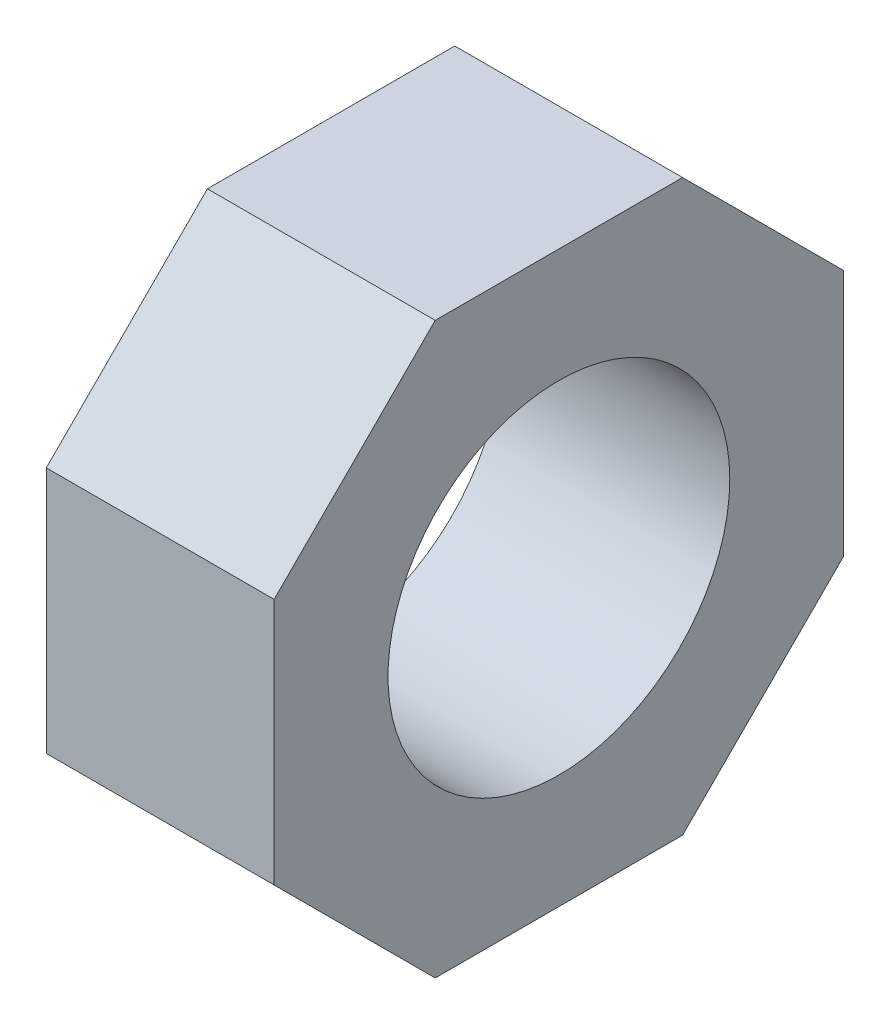
ISO-10303-21;
HEADER;
FILE_DESCRIPTION(('STEP AP214'),'2;1');
FILE_NAME('part.step','',(''),(''),'','','');
FILE_SCHEMA(('AUTOMOTIVE_DESIGN { 1 0 10303 214 1 1 1 1 }'));
ENDSEC;
DATA;
#1=APPLICATION_CONTEXT('core data for automotive mechanical design processes');
#2=APPLICATION_PROTOCOL_DEFINITION('international standard','automotive_design',2000,#1);
#3=PRODUCT_CONTEXT('',#1,'mechanical');
#4=PRODUCT('Part','Part','',(#3));
#5=PRODUCT_RELATED_PRODUCT_CATEGORY('part','',(#4));
#6=PRODUCT_DEFINITION_FORMATION('','',#4);
#7=PRODUCT_DEFINITION_CONTEXT('part definition',#1,'design');
#8=PRODUCT_DEFINITION('design','',#6,#7);
#9=PRODUCT_DEFINITION_SHAPE('','',#8);
#10=(LENGTH_UNIT() NAMED_UNIT(*) SI_UNIT(.MILLI.,.METRE.));
#11=(NAMED_UNIT(*) PLANE_ANGLE_UNIT() SI_UNIT($,.RADIAN.));
#12=(NAMED_UNIT(*) SI_UNIT($,.STERADIAN.) SOLID_ANGLE_UNIT());
#13=UNCERTAINTY_MEASURE_WITH_UNIT(LENGTH_MEASURE(1.E-05),#10,'distance_accuracy_value','');
#14=(GEOMETRIC_REPRESENTATION_CONTEXT(3) GLOBAL_UNCERTAINTY_ASSIGNED_CONTEXT((#13)) GLOBAL_UNIT_ASSIGNED_CONTEXT((#10,
#11,#12)) REPRESENTATION_CONTEXT('',''));
#15=CARTESIAN_POINT('',(0.,0.,0.));
#16=DIRECTION('',(0.,0.,1.));
#17=DIRECTION('',(1.,0.,0.));
#18=AXIS2_PLACEMENT_3D('',#15,#16,#17);
#19=CARTESIAN_POINT('',(2.,0.,0.));
#20=DIRECTION('',(1.,0.,0.));
#21=DIRECTION('',(0.,0.,-1.));
#22=AXIS2_PLACEMENT_3D('',#19,#20,#21);
#23=PLANE('',#22);
#24=DIRECTION('',(0.,0.707106781186549,0.707106781186546));
#25=VECTOR('',#24,1.);
#26=CARTESIAN_POINT('',(2.,2.5,-1.08578643762691));
#27=LINE('',#26,#25);
#28=CARTESIAN_POINT('',(2.,1.0857864376269,-2.5));
#29=VERTEX_POINT('',#28);
#30=CARTESIAN_POINT('',(2.,2.5,-1.08578643762691));
#31=VERTEX_POINT('',#30);
#32=EDGE_CURVE('E164',#29,#31,#27,.T.);
#33=ORIENTED_EDGE('',*,*,#32,.T.);
#34=DIRECTION('',(0.,0.,1.));
#35=VECTOR('',#34,1.);
#36=CARTESIAN_POINT('',(2.,2.5,1.08578643762691));
#37=LINE('',#36,#35);
#38=CARTESIAN_POINT('',(2.,2.5,1.08578643762691));
#39=VERTEX_POINT('',#38);
#40=EDGE_CURVE('E100',#31,#39,#37,.T.);
#41=ORIENTED_EDGE('',*,*,#40,.T.);
#42=DIRECTION('',(0.,-0.707106781186549,0.707106781186546));
#43=VECTOR('',#42,1.);
#44=CARTESIAN_POINT('',(2.,2.5,1.08578643762691));
#45=LINE('',#44,#43);
#46=CARTESIAN_POINT('',(2.,1.0857864376269,2.5));
#47=VERTEX_POINT('',#46);
#48=EDGE_CURVE('E185',#39,#47,#45,.T.);
#49=ORIENTED_EDGE('',*,*,#48,.T.);
#50=DIRECTION('',(0.,-1.,0.));
#51=VECTOR('',#50,1.);
#52=CARTESIAN_POINT('',(2.,1.0857864376269,2.5));
#53=LINE('',#52,#51);
#54=CARTESIAN_POINT('',(2.,-1.0857864376269,2.5));
#55=VERTEX_POINT('',#54);
#56=EDGE_CURVE('E199',#47,#55,#53,.T.);
#57=ORIENTED_EDGE('',*,*,#56,.T.);
#58=DIRECTION('',(0.,-0.707106781186549,-0.707106781186546));
#59=VECTOR('',#58,1.);
#60=CARTESIAN_POINT('',(2.,-2.5,1.08578643762691));
#61=LINE('',#60,#59);
#62=CARTESIAN_POINT('',(2.,-2.5,1.08578643762691));
#63=VERTEX_POINT('',#62);
#64=EDGE_CURVE('E119',#55,#63,#61,.T.);
#65=ORIENTED_EDGE('',*,*,#64,.T.);
#66=DIRECTION('',(0.,0.,-1.));
#67=VECTOR('',#66,1.);
#68=CARTESIAN_POINT('',(2.,-2.5,1.08578643762691));
#69=LINE('',#68,#67);
#70=CARTESIAN_POINT('',(2.,-2.5,-1.08578643762691));
#71=VERTEX_POINT('',#70);
#72=EDGE_CURVE('E113',#63,#71,#69,.T.);
#73=ORIENTED_EDGE('',*,*,#72,.T.);
#74=DIRECTION('',(0.,0.707106781186549,-0.707106781186546));
#75=VECTOR('',#74,1.);
#76=CARTESIAN_POINT('',(2.,-2.5,-1.08578643762691));
#77=LINE('',#76,#75);
#78=CARTESIAN_POINT('',(2.,-1.0857864376269,-2.5));
#79=VERTEX_POINT('',#78);
#80=EDGE_CURVE('E117',#71,#79,#77,.T.);
#81=ORIENTED_EDGE('',*,*,#80,.T.);
#82=DIRECTION('',(0.,1.,0.));
#83=VECTOR('',#82,1.);
#84=CARTESIAN_POINT('',(2.,1.0857864376269,-2.5));
#85=LINE('',#84,#83);
#86=EDGE_CURVE('E57',#79,#29,#85,.T.);
#87=ORIENTED_EDGE('',*,*,#86,.T.);
#88=EDGE_LOOP('',(#33,#41,#49,#57,#65,#73,#81,#87));
#89=FACE_BOUND('',#88,.T.);
#90=CARTESIAN_POINT('',(2.,0.,0.));
#91=DIRECTION('',(1.,0.,0.));
#92=DIRECTION('',(0.,0.,-1.));
#93=AXIS2_PLACEMENT_3D('',#90,#91,#92);
#94=CIRCLE('',#93,1.5);
#95=CARTESIAN_POINT('',(2.,0.,-1.5));
#96=VERTEX_POINT('',#95);
#97=EDGE_CURVE('E146',#96,#96,#94,.T.);
#98=ORIENTED_EDGE('',*,*,#97,.F.);
#99=EDGE_LOOP('',(#98));
#100=FACE_BOUND('',#99,.T.);
#101=ADVANCED_FACE('F39',(#89,#100),#23,.T.);
#102=CARTESIAN_POINT('',(0.,0.,0.));
#103=DIRECTION('',(1.,0.,0.));
#104=DIRECTION('',(0.,0.,-1.));
#105=AXIS2_PLACEMENT_3D('',#102,#103,#104);
#106=PLANE('',#105);
#107=DIRECTION('',(0.,0.707106781186549,0.707106781186546));
#108=VECTOR('',#107,1.);
#109=CARTESIAN_POINT('',(0.,2.5,-1.08578643762691));
#110=LINE('',#109,#108);
#111=CARTESIAN_POINT('',(0.,1.0857864376269,-2.5));
#112=VERTEX_POINT('',#111);
#113=CARTESIAN_POINT('',(0.,2.5,-1.08578643762691));
#114=VERTEX_POINT('',#113);
#115=EDGE_CURVE('E141',#112,#114,#110,.T.);
#116=ORIENTED_EDGE('',*,*,#115,.F.);
#117=DIRECTION('',(0.,1.,0.));
#118=VECTOR('',#117,1.);
#119=CARTESIAN_POINT('',(0.,1.0857864376269,-2.5));
#120=LINE('',#119,#118);
#121=CARTESIAN_POINT('',(0.,-1.0857864376269,-2.5));
#122=VERTEX_POINT('',#121);
#123=EDGE_CURVE('E92',#122,#112,#120,.T.);
#124=ORIENTED_EDGE('',*,*,#123,.F.);
#125=DIRECTION('',(0.,0.707106781186549,-0.707106781186546));
#126=VECTOR('',#125,1.);
#127=CARTESIAN_POINT('',(0.,-2.5,-1.08578643762691));
#128=LINE('',#127,#126);
#129=CARTESIAN_POINT('',(0.,-2.5,-1.08578643762691));
#130=VERTEX_POINT('',#129);
#131=EDGE_CURVE('E86',#130,#122,#128,.T.);
#132=ORIENTED_EDGE('',*,*,#131,.F.);
#133=DIRECTION('',(0.,0.,-1.));
#134=VECTOR('',#133,1.);
#135=CARTESIAN_POINT('',(0.,-2.5,1.08578643762691));
#136=LINE('',#135,#134);
#137=CARTESIAN_POINT('',(0.,-2.5,1.08578643762691));
#138=VERTEX_POINT('',#137);
#139=EDGE_CURVE('E128',#138,#130,#136,.T.);
#140=ORIENTED_EDGE('',*,*,#139,.F.);
#141=DIRECTION('',(0.,-0.707106781186549,-0.707106781186546));
#142=VECTOR('',#141,1.);
#143=CARTESIAN_POINT('',(0.,-2.5,1.08578643762691));
#144=LINE('',#143,#142);
#145=CARTESIAN_POINT('',(0.,-1.0857864376269,2.5));
#146=VERTEX_POINT('',#145);
#147=EDGE_CURVE('E155',#146,#138,#144,.T.);
#148=ORIENTED_EDGE('',*,*,#147,.F.);
#149=DIRECTION('',(0.,-1.,0.));
#150=VECTOR('',#149,1.);
#151=CARTESIAN_POINT('',(0.,1.0857864376269,2.5));
#152=LINE('',#151,#150);
#153=CARTESIAN_POINT('',(0.,1.0857864376269,2.5));
#154=VERTEX_POINT('',#153);
#155=EDGE_CURVE('E152',#154,#146,#152,.T.);
#156=ORIENTED_EDGE('',*,*,#155,.F.);
#157=DIRECTION('',(0.,-0.707106781186549,0.707106781186546));
#158=VECTOR('',#157,1.);
#159=CARTESIAN_POINT('',(0.,2.5,1.08578643762691));
#160=LINE('',#159,#158);
#161=CARTESIAN_POINT('',(0.,2.5,1.08578643762691));
#162=VERTEX_POINT('',#161);
#163=EDGE_CURVE('E149',#162,#154,#160,.T.);
#164=ORIENTED_EDGE('',*,*,#163,.F.);
#165=DIRECTION('',(0.,0.,1.));
#166=VECTOR('',#165,1.);
#167=CARTESIAN_POINT('',(0.,2.5,1.08578643762691));
#168=LINE('',#167,#166);
#169=EDGE_CURVE('E145',#114,#162,#168,.T.);
#170=ORIENTED_EDGE('',*,*,#169,.F.);
#171=EDGE_LOOP('',(#116,#124,#132,#140,#148,#156,#164,#170));
#172=FACE_BOUND('',#171,.T.);
#173=CARTESIAN_POINT('',(0.,0.,0.));
#174=DIRECTION('',(1.,0.,0.));
#175=DIRECTION('',(0.,0.,-1.));
#176=AXIS2_PLACEMENT_3D('',#173,#174,#175);
#177=CIRCLE('',#176,1.5);
#178=CARTESIAN_POINT('',(0.,0.,-1.5));
#179=VERTEX_POINT('',#178);
#180=EDGE_CURVE('E209',#179,#179,#177,.T.);
#181=ORIENTED_EDGE('',*,*,#180,.T.);
#182=EDGE_LOOP('',(#181));
#183=FACE_BOUND('',#182,.T.);
#184=ADVANCED_FACE('F189',(#172,#183),#106,.F.);
#185=CARTESIAN_POINT('',(2.,2.5,-1.08578643762691));
#186=DIRECTION('',(0.,-0.707106781186546,0.707106781186549));
#187=DIRECTION('',(0.,-0.707106781186549,-0.707106781186546));
#188=AXIS2_PLACEMENT_3D('',#185,#186,#187);
#189=PLANE('',#188);
#190=ORIENTED_EDGE('',*,*,#115,.T.);
#191=DIRECTION('',(-1.,0.,0.));
#192=VECTOR('',#191,1.);
#193=CARTESIAN_POINT('',(2.,2.5,-1.08578643762691));
#194=LINE('',#193,#192);
#195=EDGE_CURVE('E11',#31,#114,#194,.T.);
#196=ORIENTED_EDGE('',*,*,#195,.F.);
#197=ORIENTED_EDGE('',*,*,#32,.F.);
#198=DIRECTION('',(-1.,0.,0.));
#199=VECTOR('',#198,1.);
#200=CARTESIAN_POINT('',(2.,1.0857864376269,-2.5));
#201=LINE('',#200,#199);
#202=EDGE_CURVE('E137',#29,#112,#201,.T.);
#203=ORIENTED_EDGE('',*,*,#202,.T.);
#204=EDGE_LOOP('',(#190,#196,#197,#203));
#205=FACE_BOUND('',#204,.T.);
#206=ADVANCED_FACE('F41',(#205),#189,.F.);
#207=CARTESIAN_POINT('',(2.,2.5,1.08578643762691));
#208=DIRECTION('',(0.,-1.,0.));
#209=DIRECTION('',(0.,0.,-1.));
#210=AXIS2_PLACEMENT_3D('',#207,#208,#209);
#211=PLANE('',#210);
#212=ORIENTED_EDGE('',*,*,#169,.T.);
#213=DIRECTION('',(-1.,0.,0.));
#214=VECTOR('',#213,1.);
#215=CARTESIAN_POINT('',(2.,2.5,1.08578643762691));
#216=LINE('',#215,#214);
#217=EDGE_CURVE('E49',#39,#162,#216,.T.);
#218=ORIENTED_EDGE('',*,*,#217,.F.);
#219=ORIENTED_EDGE('',*,*,#40,.F.);
#220=ORIENTED_EDGE('',*,*,#195,.T.);
#221=EDGE_LOOP('',(#212,#218,#219,#220));
#222=FACE_BOUND('',#221,.T.);
#223=ADVANCED_FACE('F239',(#222),#211,.F.);
#224=CARTESIAN_POINT('',(2.,2.5,1.08578643762691));
#225=DIRECTION('',(0.,-0.707106781186546,-0.707106781186549));
#226=DIRECTION('',(0.,0.707106781186549,-0.707106781186546));
#227=AXIS2_PLACEMENT_3D('',#224,#225,#226);
#228=PLANE('',#227);
#229=ORIENTED_EDGE('',*,*,#163,.T.);
#230=DIRECTION('',(-1.,0.,0.));
#231=VECTOR('',#230,1.);
#232=CARTESIAN_POINT('',(2.,1.0857864376269,2.5));
#233=LINE('',#232,#231);
#234=EDGE_CURVE('E175',#47,#154,#233,.T.);
#235=ORIENTED_EDGE('',*,*,#234,.F.);
#236=ORIENTED_EDGE('',*,*,#48,.F.);
#237=ORIENTED_EDGE('',*,*,#217,.T.);
#238=EDGE_LOOP('',(#229,#235,#236,#237));
#239=FACE_BOUND('',#238,.T.);
#240=ADVANCED_FACE('F183',(#239),#228,.F.);
#241=CARTESIAN_POINT('',(2.,1.0857864376269,2.5));
#242=DIRECTION('',(0.,0.,-1.));
#243=DIRECTION('',(-1.,0.,0.));
#244=AXIS2_PLACEMENT_3D('',#241,#242,#243);
#245=PLANE('',#244);
#246=ORIENTED_EDGE('',*,*,#155,.T.);
#247=DIRECTION('',(-1.,0.,0.));
#248=VECTOR('',#247,1.);
#249=CARTESIAN_POINT('',(2.,-1.0857864376269,2.5));
#250=LINE('',#249,#248);
#251=EDGE_CURVE('E171',#55,#146,#250,.T.);
#252=ORIENTED_EDGE('',*,*,#251,.F.);
#253=ORIENTED_EDGE('',*,*,#56,.F.);
#254=ORIENTED_EDGE('',*,*,#234,.T.);
#255=EDGE_LOOP('',(#246,#252,#253,#254));
#256=FACE_BOUND('',#255,.T.);
#257=ADVANCED_FACE('F194',(#256),#245,.F.);
#258=CARTESIAN_POINT('',(2.,-2.5,1.08578643762691));
#259=DIRECTION('',(0.,0.707106781186546,-0.707106781186549));
#260=DIRECTION('',(0.,0.707106781186549,0.707106781186546));
#261=AXIS2_PLACEMENT_3D('',#258,#259,#260);
#262=PLANE('',#261);
#263=ORIENTED_EDGE('',*,*,#147,.T.);
#264=DIRECTION('',(-1.,0.,0.));
#265=VECTOR('',#264,1.);
#266=CARTESIAN_POINT('',(2.,-2.5,1.08578643762691));
#267=LINE('',#266,#265);
#268=EDGE_CURVE('E130',#63,#138,#267,.T.);
#269=ORIENTED_EDGE('',*,*,#268,.F.);
#270=ORIENTED_EDGE('',*,*,#64,.F.);
#271=ORIENTED_EDGE('',*,*,#251,.T.);
#272=EDGE_LOOP('',(#263,#269,#270,#271));
#273=FACE_BOUND('',#272,.T.);
#274=ADVANCED_FACE('F197',(#273),#262,.F.);
#275=CARTESIAN_POINT('',(2.,-2.5,1.08578643762691));
#276=DIRECTION('',(0.,1.,0.));
#277=DIRECTION('',(0.,0.,1.));
#278=AXIS2_PLACEMENT_3D('',#275,#276,#277);
#279=PLANE('',#278);
#280=ORIENTED_EDGE('',*,*,#139,.T.);
#281=DIRECTION('',(-1.,0.,0.));
#282=VECTOR('',#281,1.);
#283=CARTESIAN_POINT('',(2.,-2.5,-1.08578643762691));
#284=LINE('',#283,#282);
#285=EDGE_CURVE('E125',#71,#130,#284,.T.);
#286=ORIENTED_EDGE('',*,*,#285,.F.);
#287=ORIENTED_EDGE('',*,*,#72,.F.);
#288=ORIENTED_EDGE('',*,*,#268,.T.);
#289=EDGE_LOOP('',(#280,#286,#287,#288));
#290=FACE_BOUND('',#289,.T.);
#291=ADVANCED_FACE('F126',(#290),#279,.F.);
#292=CARTESIAN_POINT('',(2.,-2.5,-1.08578643762691));
#293=DIRECTION('',(0.,0.707106781186546,0.707106781186549));
#294=DIRECTION('',(0.,-0.707106781186549,0.707106781186546));
#295=AXIS2_PLACEMENT_3D('',#292,#293,#294);
#296=PLANE('',#295);
#297=ORIENTED_EDGE('',*,*,#131,.T.);
#298=DIRECTION('',(-1.,0.,0.));
#299=VECTOR('',#298,1.);
#300=CARTESIAN_POINT('',(2.,-1.0857864376269,-2.5));
#301=LINE('',#300,#299);
#302=EDGE_CURVE('E131',#79,#122,#301,.T.);
#303=ORIENTED_EDGE('',*,*,#302,.F.);
#304=ORIENTED_EDGE('',*,*,#80,.F.);
#305=ORIENTED_EDGE('',*,*,#285,.T.);
#306=EDGE_LOOP('',(#297,#303,#304,#305));
#307=FACE_BOUND('',#306,.T.);
#308=ADVANCED_FACE('F133',(#307),#296,.F.);
#309=CARTESIAN_POINT('',(2.,1.0857864376269,-2.5));
#310=DIRECTION('',(0.,0.,1.));
#311=DIRECTION('',(1.,0.,0.));
#312=AXIS2_PLACEMENT_3D('',#309,#310,#311);
#313=PLANE('',#312);
#314=ORIENTED_EDGE('',*,*,#123,.T.);
#315=ORIENTED_EDGE('',*,*,#202,.F.);
#316=ORIENTED_EDGE('',*,*,#86,.F.);
#317=ORIENTED_EDGE('',*,*,#302,.T.);
#318=EDGE_LOOP('',(#314,#315,#316,#317));
#319=FACE_BOUND('',#318,.T.);
#320=ADVANCED_FACE('F227',(#319),#313,.F.);
#321=CARTESIAN_POINT('',(2.,0.,0.));
#322=DIRECTION('',(-1.,0.,0.));
#323=DIRECTION('',(0.,0.,1.));
#324=AXIS2_PLACEMENT_3D('',#321,#322,#323);
#325=CYLINDRICAL_SURFACE('',#324,1.5);
#326=ORIENTED_EDGE('',*,*,#97,.T.);
#327=EDGE_LOOP('',(#326));
#328=FACE_BOUND('',#327,.T.);
#329=ORIENTED_EDGE('',*,*,#180,.F.);
#330=EDGE_LOOP('',(#329));
#331=FACE_BOUND('',#330,.T.);
#332=ADVANCED_FACE('F217',(#328,#331),#325,.F.);
#333=CLOSED_SHELL('',(#101,#184,#206,#223,#240,#257,#274,#291,#308,#320,#332));
#334=MANIFOLD_SOLID_BREP('B2',#333);
#335=ADVANCED_BREP_SHAPE_REPRESENTATION('',(#18,#334),#14);
#336=SHAPE_DEFINITION_REPRESENTATION(#9,#335);
ENDSEC;
END-ISO-10303-21;
